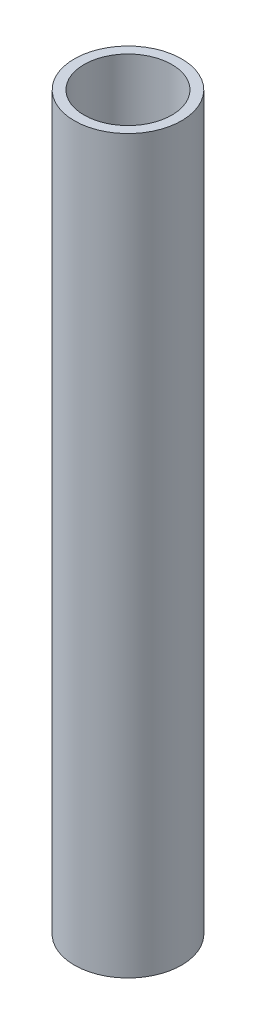
ISO-10303-21;
HEADER;
FILE_DESCRIPTION(('STEP AP214'),'2;1');
FILE_NAME('part.step','',(''),(''),'','','');
FILE_SCHEMA(('AUTOMOTIVE_DESIGN { 1 0 10303 214 1 1 1 1 }'));
ENDSEC;
DATA;
#1=APPLICATION_CONTEXT('core data for automotive mechanical design processes');
#2=APPLICATION_PROTOCOL_DEFINITION('international standard','automotive_design',2000,#1);
#3=PRODUCT_CONTEXT('',#1,'mechanical');
#4=PRODUCT('Part','Part','',(#3));
#5=PRODUCT_RELATED_PRODUCT_CATEGORY('part','',(#4));
#6=PRODUCT_DEFINITION_FORMATION('','',#4);
#7=PRODUCT_DEFINITION_CONTEXT('part definition',#1,'design');
#8=PRODUCT_DEFINITION('design','',#6,#7);
#9=PRODUCT_DEFINITION_SHAPE('','',#8);
#10=(LENGTH_UNIT() NAMED_UNIT(*) SI_UNIT(.MILLI.,.METRE.));
#11=(NAMED_UNIT(*) PLANE_ANGLE_UNIT() SI_UNIT($,.RADIAN.));
#12=(NAMED_UNIT(*) SI_UNIT($,.STERADIAN.) SOLID_ANGLE_UNIT());
#13=UNCERTAINTY_MEASURE_WITH_UNIT(LENGTH_MEASURE(1.E-05),#10,'distance_accuracy_value','');
#14=(GEOMETRIC_REPRESENTATION_CONTEXT(3) GLOBAL_UNCERTAINTY_ASSIGNED_CONTEXT((#13)) GLOBAL_UNIT_ASSIGNED_CONTEXT((#10,
#11,#12)) REPRESENTATION_CONTEXT('',''));
#15=CARTESIAN_POINT('',(0.,0.,0.));
#16=DIRECTION('',(0.,0.,1.));
#17=DIRECTION('',(1.,0.,0.));
#18=AXIS2_PLACEMENT_3D('',#15,#16,#17);
#19=CARTESIAN_POINT('',(0.,0.,0.));
#20=DIRECTION('',(0.,1.,0.));
#21=DIRECTION('',(0.,0.,1.));
#22=AXIS2_PLACEMENT_3D('',#19,#20,#21);
#23=CYLINDRICAL_SURFACE('',#22,8.99999999999999);
#24=CARTESIAN_POINT('',(0.,-174.,0.));
#25=DIRECTION('',(0.,1.,0.));
#26=DIRECTION('',(0.,0.,1.));
#27=AXIS2_PLACEMENT_3D('',#24,#25,#26);
#28=CIRCLE('',#27,8.99999999999999);
#29=CARTESIAN_POINT('',(0.,-174.,8.99999999999999));
#30=VERTEX_POINT('',#29);
#31=EDGE_CURVE('E10',#30,#30,#28,.T.);
#32=ORIENTED_EDGE('',*,*,#31,.F.);
#33=EDGE_LOOP('',(#32));
#34=FACE_BOUND('',#33,.T.);
#35=CARTESIAN_POINT('',(0.,-24.,0.));
#36=DIRECTION('',(0.,1.,0.));
#37=DIRECTION('',(0.,0.,1.));
#38=AXIS2_PLACEMENT_3D('',#35,#36,#37);
#39=CIRCLE('',#38,8.99999999999999);
#40=CARTESIAN_POINT('',(0.,-24.,8.99999999999999));
#41=VERTEX_POINT('',#40);
#42=EDGE_CURVE('E45',#41,#41,#39,.T.);
#43=ORIENTED_EDGE('',*,*,#42,.T.);
#44=EDGE_LOOP('',(#43));
#45=FACE_BOUND('',#44,.T.);
#46=ADVANCED_FACE('F31',(#34,#45),#23,.F.);
#47=CARTESIAN_POINT('',(8.99999999999999,-174.,0.));
#48=DIRECTION('',(0.,1.,0.));
#49=DIRECTION('',(0.,0.,1.));
#50=AXIS2_PLACEMENT_3D('',#47,#48,#49);
#51=PLANE('',#50);
#52=CARTESIAN_POINT('',(0.,-174.,0.));
#53=DIRECTION('',(0.,1.,0.));
#54=DIRECTION('',(0.,0.,1.));
#55=AXIS2_PLACEMENT_3D('',#52,#53,#54);
#56=CIRCLE('',#55,11.);
#57=CARTESIAN_POINT('',(0.,-174.,11.));
#58=VERTEX_POINT('',#57);
#59=EDGE_CURVE('E37',#58,#58,#56,.T.);
#60=ORIENTED_EDGE('',*,*,#59,.F.);
#61=EDGE_LOOP('',(#60));
#62=FACE_BOUND('',#61,.T.);
#63=ORIENTED_EDGE('',*,*,#31,.T.);
#64=EDGE_LOOP('',(#63));
#65=FACE_BOUND('',#64,.T.);
#66=ADVANCED_FACE('F60',(#62,#65),#51,.F.);
#67=CARTESIAN_POINT('',(0.,0.,0.));
#68=DIRECTION('',(0.,1.,0.));
#69=DIRECTION('',(0.,0.,1.));
#70=AXIS2_PLACEMENT_3D('',#67,#68,#69);
#71=CYLINDRICAL_SURFACE('',#70,11.);
#72=CARTESIAN_POINT('',(0.,-24.,0.));
#73=DIRECTION('',(0.,1.,0.));
#74=DIRECTION('',(0.,0.,1.));
#75=AXIS2_PLACEMENT_3D('',#72,#73,#74);
#76=CIRCLE('',#75,11.);
#77=CARTESIAN_POINT('',(0.,-24.,11.));
#78=VERTEX_POINT('',#77);
#79=EDGE_CURVE('E41',#78,#78,#76,.T.);
#80=ORIENTED_EDGE('',*,*,#79,.F.);
#81=EDGE_LOOP('',(#80));
#82=FACE_BOUND('',#81,.T.);
#83=ORIENTED_EDGE('',*,*,#59,.T.);
#84=EDGE_LOOP('',(#83));
#85=FACE_BOUND('',#84,.T.);
#86=ADVANCED_FACE('F55',(#82,#85),#71,.T.);
#87=CARTESIAN_POINT('',(8.99999999999999,-24.,0.));
#88=DIRECTION('',(0.,-1.,0.));
#89=DIRECTION('',(0.,0.,-1.));
#90=AXIS2_PLACEMENT_3D('',#87,#88,#89);
#91=PLANE('',#90);
#92=ORIENTED_EDGE('',*,*,#42,.F.);
#93=EDGE_LOOP('',(#92));
#94=FACE_BOUND('',#93,.T.);
#95=ORIENTED_EDGE('',*,*,#79,.T.);
#96=EDGE_LOOP('',(#95));
#97=FACE_BOUND('',#96,.T.);
#98=ADVANCED_FACE('F52',(#94,#97),#91,.F.);
#99=CLOSED_SHELL('',(#46,#66,#86,#98));
#100=MANIFOLD_SOLID_BREP('B2',#99);
#101=ADVANCED_BREP_SHAPE_REPRESENTATION('',(#18,#100),#14);
#102=SHAPE_DEFINITION_REPRESENTATION(#9,#101);
ENDSEC;
END-ISO-10303-21;
